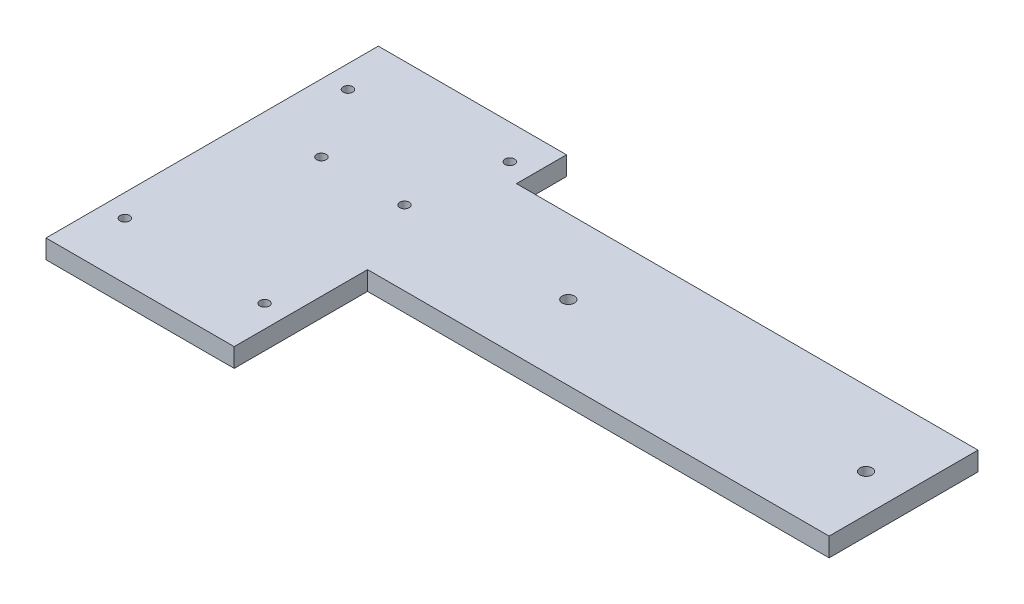
ISO-10303-21;
HEADER;
FILE_DESCRIPTION(('STEP AP214'),'2;1');
FILE_NAME('part.step','',(''),(''),'','','');
FILE_SCHEMA(('AUTOMOTIVE_DESIGN { 1 0 10303 214 1 1 1 1 }'));
ENDSEC;
DATA;
#1=APPLICATION_CONTEXT('core data for automotive mechanical design processes');
#2=APPLICATION_PROTOCOL_DEFINITION('international standard','automotive_design',2000,#1);
#3=PRODUCT_CONTEXT('',#1,'mechanical');
#4=PRODUCT('Part','Part','',(#3));
#5=PRODUCT_RELATED_PRODUCT_CATEGORY('part','',(#4));
#6=PRODUCT_DEFINITION_FORMATION('','',#4);
#7=PRODUCT_DEFINITION_CONTEXT('part definition',#1,'design');
#8=PRODUCT_DEFINITION('design','',#6,#7);
#9=PRODUCT_DEFINITION_SHAPE('','',#8);
#10=(LENGTH_UNIT() NAMED_UNIT(*) SI_UNIT(.MILLI.,.METRE.));
#11=(NAMED_UNIT(*) PLANE_ANGLE_UNIT() SI_UNIT($,.RADIAN.));
#12=(NAMED_UNIT(*) SI_UNIT($,.STERADIAN.) SOLID_ANGLE_UNIT());
#13=UNCERTAINTY_MEASURE_WITH_UNIT(LENGTH_MEASURE(1.E-05),#10,'distance_accuracy_value','');
#14=(GEOMETRIC_REPRESENTATION_CONTEXT(3) GLOBAL_UNCERTAINTY_ASSIGNED_CONTEXT((#13)) GLOBAL_UNIT_ASSIGNED_CONTEXT((#10,
#11,#12)) REPRESENTATION_CONTEXT('',''));
#15=CARTESIAN_POINT('',(0.,0.,0.));
#16=DIRECTION('',(0.,0.,1.));
#17=DIRECTION('',(1.,0.,0.));
#18=AXIS2_PLACEMENT_3D('',#15,#16,#17);
#19=CARTESIAN_POINT('',(5.,6.35,0.));
#20=DIRECTION('',(1.,0.,0.));
#21=DIRECTION('',(0.,0.,-1.));
#22=AXIS2_PLACEMENT_3D('',#19,#20,#21);
#23=PLANE('',#22);
#24=DIRECTION('',(0.,0.,1.));
#25=VECTOR('',#24,1.);
#26=CARTESIAN_POINT('',(5.,0.,0.));
#27=LINE('',#26,#25);
#28=CARTESIAN_POINT('',(5.,0.,-39.8));
#29=VERTEX_POINT('',#28);
#30=CARTESIAN_POINT('',(5.,0.,5.));
#31=VERTEX_POINT('',#30);
#32=EDGE_CURVE('E55',#29,#31,#27,.T.);
#33=ORIENTED_EDGE('',*,*,#32,.F.);
#34=DIRECTION('',(0.,1.,0.));
#35=VECTOR('',#34,1.);
#36=CARTESIAN_POINT('',(5.00000000000001,-162.864974749023,-39.8));
#37=LINE('',#36,#35);
#38=CARTESIAN_POINT('',(5.,6.35,-39.8));
#39=VERTEX_POINT('',#38);
#40=EDGE_CURVE('E50',#29,#39,#37,.T.);
#41=ORIENTED_EDGE('',*,*,#40,.T.);
#42=DIRECTION('',(0.,0.,1.));
#43=VECTOR('',#42,1.);
#44=CARTESIAN_POINT('',(5.,6.35,0.));
#45=LINE('',#44,#43);
#46=CARTESIAN_POINT('',(5.,6.35,5.));
#47=VERTEX_POINT('',#46);
#48=EDGE_CURVE('E122',#39,#47,#45,.T.);
#49=ORIENTED_EDGE('',*,*,#48,.T.);
#50=DIRECTION('',(0.,-1.,0.));
#51=VECTOR('',#50,1.);
#52=CARTESIAN_POINT('',(5.,6.35,5.));
#53=LINE('',#52,#51);
#54=EDGE_CURVE('E199',#47,#31,#53,.T.);
#55=ORIENTED_EDGE('',*,*,#54,.T.);
#56=EDGE_LOOP('',(#33,#41,#49,#55));
#57=FACE_BOUND('',#56,.T.);
#58=ADVANCED_FACE('F35',(#57),#23,.T.);
#59=CARTESIAN_POINT('',(0.,6.35,-106.6));
#60=DIRECTION('',(0.,0.,-1.));
#61=DIRECTION('',(-1.,0.,0.));
#62=AXIS2_PLACEMENT_3D('',#59,#60,#61);
#63=PLANE('',#62);
#64=DIRECTION('',(1.,0.,0.));
#65=VECTOR('',#64,1.);
#66=CARTESIAN_POINT('',(0.,0.,-106.6));
#67=LINE('',#66,#65);
#68=CARTESIAN_POINT('',(-58.2,0.,-106.6));
#69=VERTEX_POINT('',#68);
#70=CARTESIAN_POINT('',(5.,0.,-106.6));
#71=VERTEX_POINT('',#70);
#72=EDGE_CURVE('E170',#69,#71,#67,.T.);
#73=ORIENTED_EDGE('',*,*,#72,.F.);
#74=DIRECTION('',(0.,-1.,0.));
#75=VECTOR('',#74,1.);
#76=CARTESIAN_POINT('',(-58.2,6.35,-106.6));
#77=LINE('',#76,#75);
#78=CARTESIAN_POINT('',(-58.2,6.35,-106.6));
#79=VERTEX_POINT('',#78);
#80=EDGE_CURVE('E11',#79,#69,#77,.T.);
#81=ORIENTED_EDGE('',*,*,#80,.F.);
#82=DIRECTION('',(1.,0.,0.));
#83=VECTOR('',#82,1.);
#84=CARTESIAN_POINT('',(0.,6.35,-106.6));
#85=LINE('',#84,#83);
#86=CARTESIAN_POINT('',(5.,6.35,-106.6));
#87=VERTEX_POINT('',#86);
#88=EDGE_CURVE('E141',#79,#87,#85,.T.);
#89=ORIENTED_EDGE('',*,*,#88,.T.);
#90=DIRECTION('',(0.,-1.,0.));
#91=VECTOR('',#90,1.);
#92=CARTESIAN_POINT('',(5.,6.35,-106.6));
#93=LINE('',#92,#91);
#94=EDGE_CURVE('E169',#87,#71,#93,.T.);
#95=ORIENTED_EDGE('',*,*,#94,.T.);
#96=EDGE_LOOP('',(#73,#81,#89,#95));
#97=FACE_BOUND('',#96,.T.);
#98=ADVANCED_FACE('F37',(#97),#63,.T.);
#99=CARTESIAN_POINT('',(-58.2,6.35,0.));
#100=DIRECTION('',(1.,0.,0.));
#101=DIRECTION('',(0.,0.,-1.));
#102=AXIS2_PLACEMENT_3D('',#99,#100,#101);
#103=PLANE('',#102);
#104=DIRECTION('',(0.,0.,1.));
#105=VECTOR('',#104,1.);
#106=CARTESIAN_POINT('',(-58.2,0.,0.));
#107=LINE('',#106,#105);
#108=CARTESIAN_POINT('',(-58.2,0.,5.));
#109=VERTEX_POINT('',#108);
#110=EDGE_CURVE('E173',#69,#109,#107,.T.);
#111=ORIENTED_EDGE('',*,*,#110,.T.);
#112=DIRECTION('',(0.,-1.,0.));
#113=VECTOR('',#112,1.);
#114=CARTESIAN_POINT('',(-58.2,6.35,5.));
#115=LINE('',#114,#113);
#116=CARTESIAN_POINT('',(-58.2,6.35,5.));
#117=VERTEX_POINT('',#116);
#118=EDGE_CURVE('E43',#117,#109,#115,.T.);
#119=ORIENTED_EDGE('',*,*,#118,.F.);
#120=DIRECTION('',(0.,0.,1.));
#121=VECTOR('',#120,1.);
#122=CARTESIAN_POINT('',(-58.2,6.35,0.));
#123=LINE('',#122,#121);
#124=EDGE_CURVE('E144',#79,#117,#123,.T.);
#125=ORIENTED_EDGE('',*,*,#124,.F.);
#126=ORIENTED_EDGE('',*,*,#80,.T.);
#127=EDGE_LOOP('',(#111,#119,#125,#126));
#128=FACE_BOUND('',#127,.T.);
#129=ADVANCED_FACE('F215',(#128),#103,.F.);
#130=CARTESIAN_POINT('',(0.,6.35,5.));
#131=DIRECTION('',(0.,0.,-1.));
#132=DIRECTION('',(-1.,0.,0.));
#133=AXIS2_PLACEMENT_3D('',#130,#131,#132);
#134=PLANE('',#133);
#135=DIRECTION('',(1.,0.,0.));
#136=VECTOR('',#135,1.);
#137=CARTESIAN_POINT('',(0.,0.,5.));
#138=LINE('',#137,#136);
#139=EDGE_CURVE('E175',#109,#31,#138,.T.);
#140=ORIENTED_EDGE('',*,*,#139,.T.);
#141=ORIENTED_EDGE('',*,*,#54,.F.);
#142=DIRECTION('',(1.,0.,0.));
#143=VECTOR('',#142,1.);
#144=CARTESIAN_POINT('',(0.,6.35,5.));
#145=LINE('',#144,#143);
#146=EDGE_CURVE('E147',#117,#47,#145,.T.);
#147=ORIENTED_EDGE('',*,*,#146,.F.);
#148=ORIENTED_EDGE('',*,*,#118,.T.);
#149=EDGE_LOOP('',(#140,#141,#147,#148));
#150=FACE_BOUND('',#149,.T.);
#151=ADVANCED_FACE('F205',(#150),#134,.F.);
#152=CARTESIAN_POINT('',(-2.5,6.35,-95.05));
#153=DIRECTION('',(0.,-1.,0.));
#154=DIRECTION('',(0.,0.,-1.));
#155=AXIS2_PLACEMENT_3D('',#152,#153,#154);
#156=CYLINDRICAL_SURFACE('',#155,1.6);
#157=CARTESIAN_POINT('',(-2.5,6.35,-95.05));
#158=DIRECTION('',(0.,1.,0.));
#159=DIRECTION('',(0.,0.,1.));
#160=AXIS2_PLACEMENT_3D('',#157,#158,#159);
#161=CIRCLE('',#160,1.6);
#162=CARTESIAN_POINT('',(-2.5,6.35,-93.45));
#163=VERTEX_POINT('',#162);
#164=EDGE_CURVE('E163',#163,#163,#161,.T.);
#165=ORIENTED_EDGE('',*,*,#164,.T.);
#166=EDGE_LOOP('',(#165));
#167=FACE_BOUND('',#166,.T.);
#168=CARTESIAN_POINT('',(-2.5,0.,-95.05));
#169=DIRECTION('',(0.,1.,0.));
#170=DIRECTION('',(0.,0.,1.));
#171=AXIS2_PLACEMENT_3D('',#168,#169,#170);
#172=CIRCLE('',#171,1.6);
#173=CARTESIAN_POINT('',(-2.5,0.,-93.45));
#174=VERTEX_POINT('',#173);
#175=EDGE_CURVE('E193',#174,#174,#172,.T.);
#176=ORIENTED_EDGE('',*,*,#175,.F.);
#177=EDGE_LOOP('',(#176));
#178=FACE_BOUND('',#177,.T.);
#179=ADVANCED_FACE('F281',(#167,#178),#156,.F.);
#180=CARTESIAN_POINT('',(-35.5,6.35,-64.8));
#181=DIRECTION('',(0.,-1.,0.));
#182=DIRECTION('',(0.,0.,-1.));
#183=AXIS2_PLACEMENT_3D('',#180,#181,#182);
#184=CYLINDRICAL_SURFACE('',#183,1.6);
#185=CARTESIAN_POINT('',(-35.5,6.35,-64.8));
#186=DIRECTION('',(0.,1.,0.));
#187=DIRECTION('',(0.,0.,1.));
#188=AXIS2_PLACEMENT_3D('',#185,#186,#187);
#189=CIRCLE('',#188,1.6);
#190=CARTESIAN_POINT('',(-35.5,6.35,-63.2));
#191=VERTEX_POINT('',#190);
#192=EDGE_CURVE('E160',#191,#191,#189,.T.);
#193=ORIENTED_EDGE('',*,*,#192,.T.);
#194=EDGE_LOOP('',(#193));
#195=FACE_BOUND('',#194,.T.);
#196=CARTESIAN_POINT('',(-35.5,0.,-64.8));
#197=DIRECTION('',(0.,1.,0.));
#198=DIRECTION('',(0.,0.,1.));
#199=AXIS2_PLACEMENT_3D('',#196,#197,#198);
#200=CIRCLE('',#199,1.6);
#201=CARTESIAN_POINT('',(-35.5,0.,-63.2));
#202=VERTEX_POINT('',#201);
#203=EDGE_CURVE('E190',#202,#202,#200,.T.);
#204=ORIENTED_EDGE('',*,*,#203,.F.);
#205=EDGE_LOOP('',(#204));
#206=FACE_BOUND('',#205,.T.);
#207=ADVANCED_FACE('F277',(#195,#206),#184,.F.);
#208=CARTESIAN_POINT('',(-7.6,6.35,-64.8));
#209=DIRECTION('',(0.,-1.,0.));
#210=DIRECTION('',(0.,0.,-1.));
#211=AXIS2_PLACEMENT_3D('',#208,#209,#210);
#212=CYLINDRICAL_SURFACE('',#211,1.6);
#213=CARTESIAN_POINT('',(-7.6,6.35,-64.8));
#214=DIRECTION('',(0.,1.,0.));
#215=DIRECTION('',(0.,0.,1.));
#216=AXIS2_PLACEMENT_3D('',#213,#214,#215);
#217=CIRCLE('',#216,1.6);
#218=CARTESIAN_POINT('',(-7.6,6.35,-63.2));
#219=VERTEX_POINT('',#218);
#220=EDGE_CURVE('E157',#219,#219,#217,.T.);
#221=ORIENTED_EDGE('',*,*,#220,.T.);
#222=EDGE_LOOP('',(#221));
#223=FACE_BOUND('',#222,.T.);
#224=CARTESIAN_POINT('',(-7.6,0.,-64.8));
#225=DIRECTION('',(0.,1.,0.));
#226=DIRECTION('',(0.,0.,1.));
#227=AXIS2_PLACEMENT_3D('',#224,#225,#226);
#228=CIRCLE('',#227,1.6);
#229=CARTESIAN_POINT('',(-7.6,0.,-63.2));
#230=VERTEX_POINT('',#229);
#231=EDGE_CURVE('E187',#230,#230,#228,.T.);
#232=ORIENTED_EDGE('',*,*,#231,.F.);
#233=EDGE_LOOP('',(#232));
#234=FACE_BOUND('',#233,.T.);
#235=ADVANCED_FACE('F270',(#223,#234),#212,.F.);
#236=CARTESIAN_POINT('',(-50.7,6.35,-14.));
#237=DIRECTION('',(0.,-1.,0.));
#238=DIRECTION('',(0.,0.,-1.));
#239=AXIS2_PLACEMENT_3D('',#236,#237,#238);
#240=CYLINDRICAL_SURFACE('',#239,1.6);
#241=CARTESIAN_POINT('',(-50.7,6.35,-14.));
#242=DIRECTION('',(0.,1.,0.));
#243=DIRECTION('',(0.,0.,1.));
#244=AXIS2_PLACEMENT_3D('',#241,#242,#243);
#245=CIRCLE('',#244,1.6);
#246=CARTESIAN_POINT('',(-50.7,6.35,-12.4));
#247=VERTEX_POINT('',#246);
#248=EDGE_CURVE('E154',#247,#247,#245,.T.);
#249=ORIENTED_EDGE('',*,*,#248,.T.);
#250=EDGE_LOOP('',(#249));
#251=FACE_BOUND('',#250,.T.);
#252=CARTESIAN_POINT('',(-50.7,0.,-14.));
#253=DIRECTION('',(0.,1.,0.));
#254=DIRECTION('',(0.,0.,1.));
#255=AXIS2_PLACEMENT_3D('',#252,#253,#254);
#256=CIRCLE('',#255,1.6);
#257=CARTESIAN_POINT('',(-50.7,0.,-12.4));
#258=VERTEX_POINT('',#257);
#259=EDGE_CURVE('E184',#258,#258,#256,.T.);
#260=ORIENTED_EDGE('',*,*,#259,.F.);
#261=EDGE_LOOP('',(#260));
#262=FACE_BOUND('',#261,.T.);
#263=ADVANCED_FACE('F265',(#251,#262),#240,.F.);
#264=CARTESIAN_POINT('',(-2.49999999999999,6.35,-12.7));
#265=DIRECTION('',(0.,-1.,0.));
#266=DIRECTION('',(0.,0.,-1.));
#267=AXIS2_PLACEMENT_3D('',#264,#265,#266);
#268=CYLINDRICAL_SURFACE('',#267,1.6);
#269=CARTESIAN_POINT('',(-2.49999999999999,6.35,-12.7));
#270=DIRECTION('',(0.,1.,0.));
#271=DIRECTION('',(0.,0.,1.));
#272=AXIS2_PLACEMENT_3D('',#269,#270,#271);
#273=CIRCLE('',#272,1.6);
#274=CARTESIAN_POINT('',(-2.49999999999999,6.35,-11.1));
#275=VERTEX_POINT('',#274);
#276=EDGE_CURVE('E151',#275,#275,#273,.T.);
#277=ORIENTED_EDGE('',*,*,#276,.T.);
#278=EDGE_LOOP('',(#277));
#279=FACE_BOUND('',#278,.T.);
#280=CARTESIAN_POINT('',(-2.49999999999999,0.,-12.7));
#281=DIRECTION('',(0.,1.,0.));
#282=DIRECTION('',(0.,0.,1.));
#283=AXIS2_PLACEMENT_3D('',#280,#281,#282);
#284=CIRCLE('',#283,1.6);
#285=CARTESIAN_POINT('',(-2.49999999999999,0.,-11.1));
#286=VERTEX_POINT('',#285);
#287=EDGE_CURVE('E181',#286,#286,#284,.T.);
#288=ORIENTED_EDGE('',*,*,#287,.F.);
#289=EDGE_LOOP('',(#288));
#290=FACE_BOUND('',#289,.T.);
#291=ADVANCED_FACE('F258',(#279,#290),#268,.F.);
#292=DIRECTION('',(0.,1.,0.));
#293=VECTOR('',#292,1.);
#294=CARTESIAN_POINT('',(5.,-162.864974749023,-89.8));
#295=LINE('',#294,#293);
#296=CARTESIAN_POINT('',(5.,0.,-89.8));
#297=VERTEX_POINT('',#296);
#298=CARTESIAN_POINT('',(5.,6.35,-89.8));
#299=VERTEX_POINT('',#298);
#300=EDGE_CURVE('E131',#297,#299,#295,.T.);
#301=ORIENTED_EDGE('',*,*,#300,.F.);
#302=EDGE_CURVE('E178',#71,#297,#27,.T.);
#303=ORIENTED_EDGE('',*,*,#302,.F.);
#304=ORIENTED_EDGE('',*,*,#94,.F.);
#305=EDGE_CURVE('E149',#87,#299,#45,.T.);
#306=ORIENTED_EDGE('',*,*,#305,.T.);
#307=EDGE_LOOP('',(#301,#303,#304,#306));
#308=FACE_BOUND('',#307,.T.);
#309=ADVANCED_FACE('F220',(#308),#23,.T.);
#310=CARTESIAN_POINT('',(-50.7,6.35,-88.9));
#311=DIRECTION('',(0.,-1.,0.));
#312=DIRECTION('',(0.,0.,-1.));
#313=AXIS2_PLACEMENT_3D('',#310,#311,#312);
#314=CYLINDRICAL_SURFACE('',#313,1.6);
#315=CARTESIAN_POINT('',(-50.7,6.35,-88.9));
#316=DIRECTION('',(0.,1.,0.));
#317=DIRECTION('',(0.,0.,1.));
#318=AXIS2_PLACEMENT_3D('',#315,#316,#317);
#319=CIRCLE('',#318,1.6);
#320=CARTESIAN_POINT('',(-50.7,6.35,-87.3));
#321=VERTEX_POINT('',#320);
#322=EDGE_CURVE('E166',#321,#321,#319,.T.);
#323=ORIENTED_EDGE('',*,*,#322,.T.);
#324=EDGE_LOOP('',(#323));
#325=FACE_BOUND('',#324,.T.);
#326=CARTESIAN_POINT('',(-50.7,0.,-88.9));
#327=DIRECTION('',(0.,1.,0.));
#328=DIRECTION('',(0.,0.,1.));
#329=AXIS2_PLACEMENT_3D('',#326,#327,#328);
#330=CIRCLE('',#329,1.6);
#331=CARTESIAN_POINT('',(-50.7,0.,-87.3));
#332=VERTEX_POINT('',#331);
#333=EDGE_CURVE('E145',#332,#332,#330,.T.);
#334=ORIENTED_EDGE('',*,*,#333,.F.);
#335=EDGE_LOOP('',(#334));
#336=FACE_BOUND('',#335,.T.);
#337=ADVANCED_FACE('F234',(#325,#336),#314,.F.);
#338=CARTESIAN_POINT('',(0.,6.35,0.));
#339=DIRECTION('',(0.,1.,0.));
#340=DIRECTION('',(0.,0.,1.));
#341=AXIS2_PLACEMENT_3D('',#338,#339,#340);
#342=PLANE('',#341);
#343=ORIENTED_EDGE('',*,*,#88,.F.);
#344=ORIENTED_EDGE('',*,*,#124,.T.);
#345=ORIENTED_EDGE('',*,*,#146,.T.);
#346=ORIENTED_EDGE('',*,*,#48,.F.);
#347=DIRECTION('',(1.,0.,0.));
#348=VECTOR('',#347,1.);
#349=CARTESIAN_POINT('',(5.00000000000001,6.35,-39.8));
#350=LINE('',#349,#348);
#351=CARTESIAN_POINT('',(160.,6.35,-39.8));
#352=VERTEX_POINT('',#351);
#353=EDGE_CURVE('E103',#39,#352,#350,.T.);
#354=ORIENTED_EDGE('',*,*,#353,.T.);
#355=DIRECTION('',(0.,0.,-1.));
#356=VECTOR('',#355,1.);
#357=CARTESIAN_POINT('',(160.,6.35,-89.8));
#358=LINE('',#357,#356);
#359=CARTESIAN_POINT('',(160.,6.35,-89.8));
#360=VERTEX_POINT('',#359);
#361=EDGE_CURVE('E110',#352,#360,#358,.T.);
#362=ORIENTED_EDGE('',*,*,#361,.T.);
#363=DIRECTION('',(-1.,0.,0.));
#364=VECTOR('',#363,1.);
#365=CARTESIAN_POINT('',(5.,6.35,-89.8));
#366=LINE('',#365,#364);
#367=EDGE_CURVE('E116',#360,#299,#366,.T.);
#368=ORIENTED_EDGE('',*,*,#367,.T.);
#369=ORIENTED_EDGE('',*,*,#305,.F.);
#370=EDGE_LOOP('',(#343,#344,#345,#346,#354,#362,#368,#369));
#371=FACE_BOUND('',#370,.T.);
#372=ORIENTED_EDGE('',*,*,#276,.F.);
#373=EDGE_LOOP('',(#372));
#374=FACE_BOUND('',#373,.T.);
#375=ORIENTED_EDGE('',*,*,#248,.F.);
#376=EDGE_LOOP('',(#375));
#377=FACE_BOUND('',#376,.T.);
#378=ORIENTED_EDGE('',*,*,#220,.F.);
#379=EDGE_LOOP('',(#378));
#380=FACE_BOUND('',#379,.T.);
#381=ORIENTED_EDGE('',*,*,#192,.F.);
#382=EDGE_LOOP('',(#381));
#383=FACE_BOUND('',#382,.T.);
#384=ORIENTED_EDGE('',*,*,#164,.F.);
#385=EDGE_LOOP('',(#384));
#386=FACE_BOUND('',#385,.T.);
#387=ORIENTED_EDGE('',*,*,#322,.F.);
#388=EDGE_LOOP('',(#387));
#389=FACE_BOUND('',#388,.T.);
#390=CARTESIAN_POINT('',(147.4,6.35,-64.8));
#391=DIRECTION('',(0.,1.,0.));
#392=DIRECTION('',(0.,0.,1.));
#393=AXIS2_PLACEMENT_3D('',#390,#391,#392);
#394=CIRCLE('',#393,2.04999999999999);
#395=CARTESIAN_POINT('',(147.4,6.35,-62.75));
#396=VERTEX_POINT('',#395);
#397=EDGE_CURVE('E126',#396,#396,#394,.T.);
#398=ORIENTED_EDGE('',*,*,#397,.F.);
#399=EDGE_LOOP('',(#398));
#400=FACE_BOUND('',#399,.T.);
#401=CARTESIAN_POINT('',(47.4,6.35,-64.8));
#402=DIRECTION('',(0.,1.,0.));
#403=DIRECTION('',(0.,0.,1.));
#404=AXIS2_PLACEMENT_3D('',#401,#402,#403);
#405=CIRCLE('',#404,2.04999999999999);
#406=CARTESIAN_POINT('',(47.4,6.35,-62.75));
#407=VERTEX_POINT('',#406);
#408=EDGE_CURVE('E123',#407,#407,#405,.T.);
#409=ORIENTED_EDGE('',*,*,#408,.F.);
#410=EDGE_LOOP('',(#409));
#411=FACE_BOUND('',#410,.T.);
#412=ADVANCED_FACE('F119',(#371,#374,#377,#380,#383,#386,#389,#400,#411),#342,.T.);
#413=CARTESIAN_POINT('',(0.,0.,0.));
#414=DIRECTION('',(0.,1.,0.));
#415=DIRECTION('',(0.,0.,1.));
#416=AXIS2_PLACEMENT_3D('',#413,#414,#415);
#417=PLANE('',#416);
#418=ORIENTED_EDGE('',*,*,#72,.T.);
#419=ORIENTED_EDGE('',*,*,#302,.T.);
#420=DIRECTION('',(1.,0.,0.));
#421=VECTOR('',#420,1.);
#422=CARTESIAN_POINT('',(5.,0.,-89.8));
#423=LINE('',#422,#421);
#424=CARTESIAN_POINT('',(160.,0.,-89.8));
#425=VERTEX_POINT('',#424);
#426=EDGE_CURVE('E223',#297,#425,#423,.T.);
#427=ORIENTED_EDGE('',*,*,#426,.T.);
#428=DIRECTION('',(0.,0.,1.));
#429=VECTOR('',#428,1.);
#430=CARTESIAN_POINT('',(160.,0.,-89.8));
#431=LINE('',#430,#429);
#432=CARTESIAN_POINT('',(160.,0.,-39.8));
#433=VERTEX_POINT('',#432);
#434=EDGE_CURVE('E134',#425,#433,#431,.T.);
#435=ORIENTED_EDGE('',*,*,#434,.T.);
#436=DIRECTION('',(-1.,0.,0.));
#437=VECTOR('',#436,1.);
#438=CARTESIAN_POINT('',(5.00000000000001,0.,-39.8));
#439=LINE('',#438,#437);
#440=EDGE_CURVE('E104',#433,#29,#439,.T.);
#441=ORIENTED_EDGE('',*,*,#440,.T.);
#442=ORIENTED_EDGE('',*,*,#32,.T.);
#443=ORIENTED_EDGE('',*,*,#139,.F.);
#444=ORIENTED_EDGE('',*,*,#110,.F.);
#445=EDGE_LOOP('',(#418,#419,#427,#435,#441,#442,#443,#444));
#446=FACE_BOUND('',#445,.T.);
#447=ORIENTED_EDGE('',*,*,#287,.T.);
#448=EDGE_LOOP('',(#447));
#449=FACE_BOUND('',#448,.T.);
#450=ORIENTED_EDGE('',*,*,#259,.T.);
#451=EDGE_LOOP('',(#450));
#452=FACE_BOUND('',#451,.T.);
#453=ORIENTED_EDGE('',*,*,#231,.T.);
#454=EDGE_LOOP('',(#453));
#455=FACE_BOUND('',#454,.T.);
#456=ORIENTED_EDGE('',*,*,#203,.T.);
#457=EDGE_LOOP('',(#456));
#458=FACE_BOUND('',#457,.T.);
#459=ORIENTED_EDGE('',*,*,#175,.T.);
#460=EDGE_LOOP('',(#459));
#461=FACE_BOUND('',#460,.T.);
#462=ORIENTED_EDGE('',*,*,#333,.T.);
#463=EDGE_LOOP('',(#462));
#464=FACE_BOUND('',#463,.T.);
#465=CARTESIAN_POINT('',(147.4,0.,-64.8));
#466=DIRECTION('',(0.,1.,0.));
#467=DIRECTION('',(0.,0.,1.));
#468=AXIS2_PLACEMENT_3D('',#465,#466,#467);
#469=CIRCLE('',#468,2.04999999999999);
#470=CARTESIAN_POINT('',(147.4,0.,-62.75));
#471=VERTEX_POINT('',#470);
#472=EDGE_CURVE('E137',#471,#471,#469,.F.);
#473=ORIENTED_EDGE('',*,*,#472,.F.);
#474=EDGE_LOOP('',(#473));
#475=FACE_BOUND('',#474,.T.);
#476=CARTESIAN_POINT('',(47.4,0.,-64.8));
#477=DIRECTION('',(0.,1.,0.));
#478=DIRECTION('',(0.,0.,1.));
#479=AXIS2_PLACEMENT_3D('',#476,#477,#478);
#480=CIRCLE('',#479,2.04999999999999);
#481=CARTESIAN_POINT('',(47.4,0.,-62.75));
#482=VERTEX_POINT('',#481);
#483=EDGE_CURVE('E140',#482,#482,#480,.F.);
#484=ORIENTED_EDGE('',*,*,#483,.F.);
#485=EDGE_LOOP('',(#484));
#486=FACE_BOUND('',#485,.T.);
#487=ADVANCED_FACE('F211',(#446,#449,#452,#455,#458,#461,#464,#475,#486),#417,.F.);
#488=CARTESIAN_POINT('',(5.00000000000001,-162.864974749023,-39.8));
#489=DIRECTION('',(0.,0.,1.));
#490=DIRECTION('',(1.,0.,0.));
#491=AXIS2_PLACEMENT_3D('',#488,#489,#490);
#492=PLANE('',#491);
#493=ORIENTED_EDGE('',*,*,#440,.F.);
#494=DIRECTION('',(0.,1.,0.));
#495=VECTOR('',#494,1.);
#496=CARTESIAN_POINT('',(160.,-162.864974749023,-39.8));
#497=LINE('',#496,#495);
#498=EDGE_CURVE('E99',#433,#352,#497,.T.);
#499=ORIENTED_EDGE('',*,*,#498,.T.);
#500=ORIENTED_EDGE('',*,*,#353,.F.);
#501=ORIENTED_EDGE('',*,*,#40,.F.);
#502=EDGE_LOOP('',(#493,#499,#500,#501));
#503=FACE_BOUND('',#502,.T.);
#504=ADVANCED_FACE('F101',(#503),#492,.T.);
#505=CARTESIAN_POINT('',(160.,-162.864974749023,-89.8));
#506=DIRECTION('',(1.,0.,0.));
#507=DIRECTION('',(0.,0.,-1.));
#508=AXIS2_PLACEMENT_3D('',#505,#506,#507);
#509=PLANE('',#508);
#510=ORIENTED_EDGE('',*,*,#434,.F.);
#511=DIRECTION('',(0.,1.,0.));
#512=VECTOR('',#511,1.);
#513=CARTESIAN_POINT('',(160.,-162.864974749023,-89.8));
#514=LINE('',#513,#512);
#515=EDGE_CURVE('E107',#425,#360,#514,.T.);
#516=ORIENTED_EDGE('',*,*,#515,.T.);
#517=ORIENTED_EDGE('',*,*,#361,.F.);
#518=ORIENTED_EDGE('',*,*,#498,.F.);
#519=EDGE_LOOP('',(#510,#516,#517,#518));
#520=FACE_BOUND('',#519,.T.);
#521=ADVANCED_FACE('F111',(#520),#509,.T.);
#522=CARTESIAN_POINT('',(5.,-162.864974749023,-89.8));
#523=DIRECTION('',(0.,0.,-1.));
#524=DIRECTION('',(-1.,0.,0.));
#525=AXIS2_PLACEMENT_3D('',#522,#523,#524);
#526=PLANE('',#525);
#527=ORIENTED_EDGE('',*,*,#426,.F.);
#528=ORIENTED_EDGE('',*,*,#300,.T.);
#529=ORIENTED_EDGE('',*,*,#367,.F.);
#530=ORIENTED_EDGE('',*,*,#515,.F.);
#531=EDGE_LOOP('',(#527,#528,#529,#530));
#532=FACE_BOUND('',#531,.T.);
#533=ADVANCED_FACE('F222',(#532),#526,.T.);
#534=CARTESIAN_POINT('',(47.4,-162.864974749023,-64.8));
#535=DIRECTION('',(0.,1.,0.));
#536=DIRECTION('',(0.,0.,1.));
#537=AXIS2_PLACEMENT_3D('',#534,#535,#536);
#538=CYLINDRICAL_SURFACE('',#537,2.04999999999999);
#539=ORIENTED_EDGE('',*,*,#483,.T.);
#540=EDGE_LOOP('',(#539));
#541=FACE_BOUND('',#540,.T.);
#542=ORIENTED_EDGE('',*,*,#408,.T.);
#543=EDGE_LOOP('',(#542));
#544=FACE_BOUND('',#543,.T.);
#545=ADVANCED_FACE('F238',(#541,#544),#538,.F.);
#546=CARTESIAN_POINT('',(147.4,-162.864974749023,-64.8));
#547=DIRECTION('',(0.,1.,0.));
#548=DIRECTION('',(0.,0.,1.));
#549=AXIS2_PLACEMENT_3D('',#546,#547,#548);
#550=CYLINDRICAL_SURFACE('',#549,2.04999999999999);
#551=ORIENTED_EDGE('',*,*,#472,.T.);
#552=EDGE_LOOP('',(#551));
#553=FACE_BOUND('',#552,.T.);
#554=ORIENTED_EDGE('',*,*,#397,.T.);
#555=EDGE_LOOP('',(#554));
#556=FACE_BOUND('',#555,.T.);
#557=ADVANCED_FACE('F230',(#553,#556),#550,.F.);
#558=CLOSED_SHELL('',(#58,#98,#129,#151,#179,#207,#235,#263,#291,#309,#337,#412,#487,#504,#521,
#533,#545,#557));
#559=MANIFOLD_SOLID_BREP('B2',#558);
#560=ADVANCED_BREP_SHAPE_REPRESENTATION('',(#18,#559),#14);
#561=SHAPE_DEFINITION_REPRESENTATION(#9,#560);
ENDSEC;
END-ISO-10303-21;
